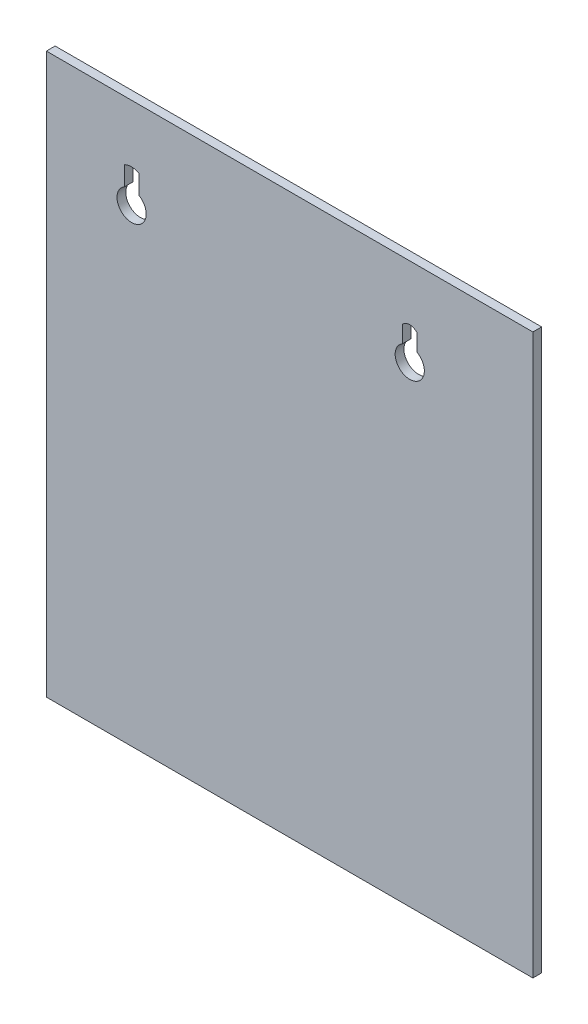
ISO-10303-21;
HEADER;
FILE_DESCRIPTION(('STEP AP214'),'2;1');
FILE_NAME('part.step','',(''),(''),'','','');
FILE_SCHEMA(('AUTOMOTIVE_DESIGN { 1 0 10303 214 1 1 1 1 }'));
ENDSEC;
DATA;
#1=APPLICATION_CONTEXT('core data for automotive mechanical design processes');
#2=APPLICATION_PROTOCOL_DEFINITION('international standard','automotive_design',2000,#1);
#3=PRODUCT_CONTEXT('',#1,'mechanical');
#4=PRODUCT('Part','Part','',(#3));
#5=PRODUCT_RELATED_PRODUCT_CATEGORY('part','',(#4));
#6=PRODUCT_DEFINITION_FORMATION('','',#4);
#7=PRODUCT_DEFINITION_CONTEXT('part definition',#1,'design');
#8=PRODUCT_DEFINITION('design','',#6,#7);
#9=PRODUCT_DEFINITION_SHAPE('','',#8);
#10=(LENGTH_UNIT() NAMED_UNIT(*) SI_UNIT(.MILLI.,.METRE.));
#11=(NAMED_UNIT(*) PLANE_ANGLE_UNIT() SI_UNIT($,.RADIAN.));
#12=(NAMED_UNIT(*) SI_UNIT($,.STERADIAN.) SOLID_ANGLE_UNIT());
#13=UNCERTAINTY_MEASURE_WITH_UNIT(LENGTH_MEASURE(1.E-05),#10,'distance_accuracy_value','');
#14=(GEOMETRIC_REPRESENTATION_CONTEXT(3) GLOBAL_UNCERTAINTY_ASSIGNED_CONTEXT((#13)) GLOBAL_UNIT_ASSIGNED_CONTEXT((#10,
#11,#12)) REPRESENTATION_CONTEXT('',''));
#15=CARTESIAN_POINT('',(0.,0.,0.));
#16=DIRECTION('',(0.,0.,1.));
#17=DIRECTION('',(1.,0.,0.));
#18=AXIS2_PLACEMENT_3D('',#15,#16,#17);
#19=CARTESIAN_POINT('',(0.,0.,1.8));
#20=DIRECTION('',(0.,0.,1.));
#21=DIRECTION('',(1.,0.,0.));
#22=AXIS2_PLACEMENT_3D('',#19,#20,#21);
#23=PLANE('',#22);
#24=CARTESIAN_POINT('',(25.7422564580005,6.75733795317251,1.8));
#25=DIRECTION('',(0.,0.,1.));
#26=DIRECTION('',(1.,0.,0.));
#27=AXIS2_PLACEMENT_3D('',#24,#25,#26);
#28=CIRCLE('',#27,3.);
#29=CARTESIAN_POINT('',(24.2422564580005,9.35541416452583,1.8));
#30=VERTEX_POINT('',#29);
#31=CARTESIAN_POINT('',(27.2422564580005,9.35541416452583,1.8));
#32=VERTEX_POINT('',#31);
#33=EDGE_CURVE('E47',#30,#32,#28,.T.);
#34=ORIENTED_EDGE('',*,*,#33,.F.);
#35=DIRECTION('',(0.,-1.,0.));
#36=VECTOR('',#35,1.);
#37=CARTESIAN_POINT('',(24.2422564580005,9.35541416452583,1.8));
#38=LINE('',#37,#36);
#39=CARTESIAN_POINT('',(24.2422564580005,12.8568097519284,1.8));
#40=VERTEX_POINT('',#39);
#41=EDGE_CURVE('E139',#40,#30,#38,.T.);
#42=ORIENTED_EDGE('',*,*,#41,.F.);
#43=CARTESIAN_POINT('',(27.2422564580005,12.8568097519284,1.8));
#44=CARTESIAN_POINT('',(25.7422564580005,14.1327453579018,1.8));
#45=CARTESIAN_POINT('',(24.2422564580005,12.8568097519284,1.8));
#46=B_SPLINE_CURVE_WITH_KNOTS('',2,(#43,#44,#45),.UNSPECIFIED.,.F.,.F.,(3,3),(0.,1.),.UNSPECIFIED.);
#47=CARTESIAN_POINT('',(27.2422564580005,12.8568097519284,1.8));
#48=VERTEX_POINT('',#47);
#49=EDGE_CURVE('E124',#48,#40,#46,.T.);
#50=ORIENTED_EDGE('',*,*,#49,.F.);
#51=DIRECTION('',(0.,1.,0.));
#52=VECTOR('',#51,1.);
#53=CARTESIAN_POINT('',(27.2422564580005,9.35541416452583,1.8));
#54=LINE('',#53,#52);
#55=EDGE_CURVE('E133',#32,#48,#54,.T.);
#56=ORIENTED_EDGE('',*,*,#55,.F.);
#57=EDGE_LOOP('',(#34,#42,#50,#56));
#58=FACE_BOUND('',#57,.T.);
#59=DIRECTION('',(0.,-1.,0.));
#60=VECTOR('',#59,1.);
#61=CARTESIAN_POINT('',(-48.9504376898145,24.8583569405099,1.8));
#62=LINE('',#61,#60);
#63=CARTESIAN_POINT('',(-48.9504376898145,24.8583569405099,1.8));
#64=VERTEX_POINT('',#63);
#65=CARTESIAN_POINT('',(-48.9504376898145,-90.1416430594901,1.8));
#66=VERTEX_POINT('',#65);
#67=EDGE_CURVE('E222',#64,#66,#62,.T.);
#68=ORIENTED_EDGE('',*,*,#67,.T.);
#69=DIRECTION('',(1.,0.,0.));
#70=VECTOR('',#69,1.);
#71=CARTESIAN_POINT('',(-48.9504376898145,-90.1416430594901,1.8));
#72=LINE('',#71,#70);
#73=CARTESIAN_POINT('',(51.0495623101855,-90.1416430594901,1.8));
#74=VERTEX_POINT('',#73);
#75=EDGE_CURVE('E385',#66,#74,#72,.T.);
#76=ORIENTED_EDGE('',*,*,#75,.T.);
#77=DIRECTION('',(0.,1.,0.));
#78=VECTOR('',#77,1.);
#79=CARTESIAN_POINT('',(51.0495623101855,24.8583569405099,1.8));
#80=LINE('',#79,#78);
#81=CARTESIAN_POINT('',(51.0495623101855,24.8583569405099,1.8));
#82=VERTEX_POINT('',#81);
#83=EDGE_CURVE('E215',#74,#82,#80,.T.);
#84=ORIENTED_EDGE('',*,*,#83,.T.);
#85=DIRECTION('',(-1.,0.,0.));
#86=VECTOR('',#85,1.);
#87=CARTESIAN_POINT('',(-48.9504376898145,24.8583569405099,1.8));
#88=LINE('',#87,#86);
#89=EDGE_CURVE('E229',#82,#64,#88,.T.);
#90=ORIENTED_EDGE('',*,*,#89,.T.);
#91=EDGE_LOOP('',(#68,#76,#84,#90));
#92=FACE_BOUND('',#91,.T.);
#93=DIRECTION('',(0.,-1.,0.));
#94=VECTOR('',#93,1.);
#95=CARTESIAN_POINT('',(-29.9284010584188,0.,1.8));
#96=LINE('',#95,#94);
#97=CARTESIAN_POINT('',(-29.9284010584188,12.65398339039,1.8));
#98=VERTEX_POINT('',#97);
#99=CARTESIAN_POINT('',(-29.9284010584188,8.69056144821355,1.8));
#100=VERTEX_POINT('',#99);
#101=EDGE_CURVE('E375',#98,#100,#96,.T.);
#102=ORIENTED_EDGE('',*,*,#101,.T.);
#103=CARTESIAN_POINT('',(-31.4284010584188,6.09248523686024,1.8));
#104=DIRECTION('',(0.,0.,1.));
#105=DIRECTION('',(1.,0.,0.));
#106=AXIS2_PLACEMENT_3D('',#103,#104,#105);
#107=CIRCLE('',#106,3.);
#108=CARTESIAN_POINT('',(-32.9284010584188,8.69056144821355,1.8));
#109=VERTEX_POINT('',#108);
#110=EDGE_CURVE('E381',#100,#109,#107,.F.);
#111=ORIENTED_EDGE('',*,*,#110,.T.);
#112=DIRECTION('',(0.,1.,0.));
#113=VECTOR('',#112,1.);
#114=CARTESIAN_POINT('',(-32.9284010584188,0.,1.8));
#115=LINE('',#114,#113);
#116=CARTESIAN_POINT('',(-32.9284010584188,12.65398339039,1.8));
#117=VERTEX_POINT('',#116);
#118=EDGE_CURVE('E350',#109,#117,#115,.T.);
#119=ORIENTED_EDGE('',*,*,#118,.T.);
#120=CARTESIAN_POINT('',(-29.9284010584188,12.65398339039,1.8));
#121=CARTESIAN_POINT('',(-31.4284010584188,13.3455747811932,1.8));
#122=CARTESIAN_POINT('',(-32.9284010584188,12.65398339039,1.8));
#123=B_SPLINE_CURVE_WITH_KNOTS('',2,(#120,#121,#122),.UNSPECIFIED.,.F.,.F.,(3,3),(0.,1.),.UNSPECIFIED.);
#124=EDGE_CURVE('E370',#117,#98,#123,.F.);
#125=ORIENTED_EDGE('',*,*,#124,.T.);
#126=EDGE_LOOP('',(#102,#111,#119,#125));
#127=FACE_BOUND('',#126,.T.);
#128=ADVANCED_FACE('F32',(#58,#92,#127),#23,.T.);
#129=CARTESIAN_POINT('',(0.,0.,0.));
#130=DIRECTION('',(0.,0.,1.));
#131=DIRECTION('',(1.,0.,0.));
#132=AXIS2_PLACEMENT_3D('',#129,#130,#131);
#133=PLANE('',#132);
#134=DIRECTION('',(0.,-1.,0.));
#135=VECTOR('',#134,1.);
#136=CARTESIAN_POINT('',(24.2422564580005,0.,0.));
#137=LINE('',#136,#135);
#138=CARTESIAN_POINT('',(24.2422564580005,12.8568097519284,0.));
#139=VERTEX_POINT('',#138);
#140=CARTESIAN_POINT('',(24.2422564580005,9.35541416452583,0.));
#141=VERTEX_POINT('',#140);
#142=EDGE_CURVE('E40',#139,#141,#137,.T.);
#143=ORIENTED_EDGE('',*,*,#142,.T.);
#144=CARTESIAN_POINT('',(25.7422564580005,6.75733795317251,0.));
#145=DIRECTION('',(0.,0.,1.));
#146=DIRECTION('',(1.,0.,0.));
#147=AXIS2_PLACEMENT_3D('',#144,#145,#146);
#148=CIRCLE('',#147,3.);
#149=CARTESIAN_POINT('',(27.2422564580005,9.35541416452583,0.));
#150=VERTEX_POINT('',#149);
#151=EDGE_CURVE('E11',#141,#150,#148,.T.);
#152=ORIENTED_EDGE('',*,*,#151,.T.);
#153=DIRECTION('',(0.,1.,0.));
#154=VECTOR('',#153,1.);
#155=CARTESIAN_POINT('',(27.2422564580005,0.,0.));
#156=LINE('',#155,#154);
#157=CARTESIAN_POINT('',(27.2422564580005,12.8568097519284,0.));
#158=VERTEX_POINT('',#157);
#159=EDGE_CURVE('E232',#150,#158,#156,.T.);
#160=ORIENTED_EDGE('',*,*,#159,.T.);
#161=CARTESIAN_POINT('',(27.2422564580005,12.8568097519284,0.));
#162=CARTESIAN_POINT('',(25.7422564580005,14.1327453579018,0.));
#163=CARTESIAN_POINT('',(24.2422564580005,12.8568097519284,0.));
#164=B_SPLINE_CURVE_WITH_KNOTS('',2,(#161,#162,#163),.UNSPECIFIED.,.F.,.F.,(3,3),(0.,1.),.UNSPECIFIED.);
#165=EDGE_CURVE('E127',#158,#139,#164,.T.);
#166=ORIENTED_EDGE('',*,*,#165,.T.);
#167=EDGE_LOOP('',(#143,#152,#160,#166));
#168=FACE_BOUND('',#167,.T.);
#169=DIRECTION('',(0.,-1.,0.));
#170=VECTOR('',#169,1.);
#171=CARTESIAN_POINT('',(-48.9504376898145,24.8583569405099,0.));
#172=LINE('',#171,#170);
#173=CARTESIAN_POINT('',(-48.9504376898145,24.8583569405099,0.));
#174=VERTEX_POINT('',#173);
#175=CARTESIAN_POINT('',(-48.9504376898145,-90.1416430594901,0.));
#176=VERTEX_POINT('',#175);
#177=EDGE_CURVE('E211',#174,#176,#172,.T.);
#178=ORIENTED_EDGE('',*,*,#177,.F.);
#179=DIRECTION('',(-1.,0.,0.));
#180=VECTOR('',#179,1.);
#181=CARTESIAN_POINT('',(-48.9504376898145,24.8583569405099,0.));
#182=LINE('',#181,#180);
#183=CARTESIAN_POINT('',(51.0495623101855,24.8583569405099,0.));
#184=VERTEX_POINT('',#183);
#185=EDGE_CURVE('E220',#184,#174,#182,.T.);
#186=ORIENTED_EDGE('',*,*,#185,.F.);
#187=DIRECTION('',(0.,1.,0.));
#188=VECTOR('',#187,1.);
#189=CARTESIAN_POINT('',(51.0495623101855,24.8583569405099,0.));
#190=LINE('',#189,#188);
#191=CARTESIAN_POINT('',(51.0495623101855,-90.1416430594901,0.));
#192=VERTEX_POINT('',#191);
#193=EDGE_CURVE('E210',#192,#184,#190,.T.);
#194=ORIENTED_EDGE('',*,*,#193,.F.);
#195=DIRECTION('',(1.,0.,0.));
#196=VECTOR('',#195,1.);
#197=CARTESIAN_POINT('',(-48.9504376898145,-90.1416430594901,0.));
#198=LINE('',#197,#196);
#199=EDGE_CURVE('E200',#176,#192,#198,.T.);
#200=ORIENTED_EDGE('',*,*,#199,.F.);
#201=EDGE_LOOP('',(#178,#186,#194,#200));
#202=FACE_BOUND('',#201,.T.);
#203=CARTESIAN_POINT('',(-31.4284010584188,6.09248523686024,0.));
#204=DIRECTION('',(0.,0.,1.));
#205=DIRECTION('',(1.,0.,0.));
#206=AXIS2_PLACEMENT_3D('',#203,#204,#205);
#207=CIRCLE('',#206,3.);
#208=CARTESIAN_POINT('',(-32.9284010584188,8.69056144821355,0.));
#209=VERTEX_POINT('',#208);
#210=CARTESIAN_POINT('',(-29.9284010584188,8.69056144821355,0.));
#211=VERTEX_POINT('',#210);
#212=EDGE_CURVE('E151',#209,#211,#207,.T.);
#213=ORIENTED_EDGE('',*,*,#212,.T.);
#214=DIRECTION('',(0.,1.,0.));
#215=VECTOR('',#214,1.);
#216=CARTESIAN_POINT('',(-29.9284010584188,8.69056144821355,0.));
#217=LINE('',#216,#215);
#218=CARTESIAN_POINT('',(-29.9284010584188,12.65398339039,0.));
#219=VERTEX_POINT('',#218);
#220=EDGE_CURVE('E359',#211,#219,#217,.T.);
#221=ORIENTED_EDGE('',*,*,#220,.T.);
#222=CARTESIAN_POINT('',(-29.9284010584188,12.65398339039,0.));
#223=CARTESIAN_POINT('',(-31.4284010584188,13.3455747811932,0.));
#224=CARTESIAN_POINT('',(-32.9284010584188,12.65398339039,0.));
#225=B_SPLINE_CURVE_WITH_KNOTS('',2,(#222,#223,#224),.UNSPECIFIED.,.F.,.F.,(3,3),(0.,1.),.UNSPECIFIED.);
#226=CARTESIAN_POINT('',(-32.9284010584188,12.65398339039,0.));
#227=VERTEX_POINT('',#226);
#228=EDGE_CURVE('E357',#219,#227,#225,.T.);
#229=ORIENTED_EDGE('',*,*,#228,.T.);
#230=DIRECTION('',(0.,-1.,0.));
#231=VECTOR('',#230,1.);
#232=CARTESIAN_POINT('',(-32.9284010584188,8.69056144821355,0.));
#233=LINE('',#232,#231);
#234=EDGE_CURVE('E347',#227,#209,#233,.T.);
#235=ORIENTED_EDGE('',*,*,#234,.T.);
#236=EDGE_LOOP('',(#213,#221,#229,#235));
#237=FACE_BOUND('',#236,.T.);
#238=ADVANCED_FACE('F181',(#168,#202,#237),#133,.F.);
#239=CARTESIAN_POINT('',(-48.9504376898145,24.8583569405099,1.8));
#240=DIRECTION('',(1.,0.,0.));
#241=DIRECTION('',(0.,1.,0.));
#242=AXIS2_PLACEMENT_3D('',#239,#240,#241);
#243=PLANE('',#242);
#244=ORIENTED_EDGE('',*,*,#177,.T.);
#245=DIRECTION('',(0.,0.,-1.));
#246=VECTOR('',#245,1.);
#247=CARTESIAN_POINT('',(-48.9504376898145,-90.1416430594901,1.8));
#248=LINE('',#247,#246);
#249=EDGE_CURVE('E205',#66,#176,#248,.T.);
#250=ORIENTED_EDGE('',*,*,#249,.F.);
#251=ORIENTED_EDGE('',*,*,#67,.F.);
#252=DIRECTION('',(0.,0.,-1.));
#253=VECTOR('',#252,1.);
#254=CARTESIAN_POINT('',(-48.9504376898145,24.8583569405099,1.8));
#255=LINE('',#254,#253);
#256=EDGE_CURVE('E226',#64,#174,#255,.T.);
#257=ORIENTED_EDGE('',*,*,#256,.T.);
#258=EDGE_LOOP('',(#244,#250,#251,#257));
#259=FACE_BOUND('',#258,.T.);
#260=ADVANCED_FACE('F34',(#259),#243,.F.);
#261=CARTESIAN_POINT('',(-48.9504376898145,-90.1416430594901,1.8));
#262=DIRECTION('',(0.,1.,0.));
#263=DIRECTION('',(0.,0.,1.));
#264=AXIS2_PLACEMENT_3D('',#261,#262,#263);
#265=PLANE('',#264);
#266=ORIENTED_EDGE('',*,*,#199,.T.);
#267=DIRECTION('',(0.,0.,-1.));
#268=VECTOR('',#267,1.);
#269=CARTESIAN_POINT('',(51.0495623101855,-90.1416430594901,1.8));
#270=LINE('',#269,#268);
#271=EDGE_CURVE('E202',#74,#192,#270,.T.);
#272=ORIENTED_EDGE('',*,*,#271,.F.);
#273=ORIENTED_EDGE('',*,*,#75,.F.);
#274=ORIENTED_EDGE('',*,*,#249,.T.);
#275=EDGE_LOOP('',(#266,#272,#273,#274));
#276=FACE_BOUND('',#275,.T.);
#277=ADVANCED_FACE('F190',(#276),#265,.F.);
#278=CARTESIAN_POINT('',(51.0495623101855,24.8583569405099,1.8));
#279=DIRECTION('',(-1.,0.,0.));
#280=DIRECTION('',(0.,-1.,0.));
#281=AXIS2_PLACEMENT_3D('',#278,#279,#280);
#282=PLANE('',#281);
#283=ORIENTED_EDGE('',*,*,#193,.T.);
#284=DIRECTION('',(0.,0.,-1.));
#285=VECTOR('',#284,1.);
#286=CARTESIAN_POINT('',(51.0495623101855,24.8583569405099,1.8));
#287=LINE('',#286,#285);
#288=EDGE_CURVE('E216',#82,#184,#287,.T.);
#289=ORIENTED_EDGE('',*,*,#288,.F.);
#290=ORIENTED_EDGE('',*,*,#83,.F.);
#291=ORIENTED_EDGE('',*,*,#271,.T.);
#292=EDGE_LOOP('',(#283,#289,#290,#291));
#293=FACE_BOUND('',#292,.T.);
#294=ADVANCED_FACE('F187',(#293),#282,.F.);
#295=CARTESIAN_POINT('',(-48.9504376898145,24.8583569405099,1.8));
#296=DIRECTION('',(0.,-1.,0.));
#297=DIRECTION('',(0.,0.,-1.));
#298=AXIS2_PLACEMENT_3D('',#295,#296,#297);
#299=PLANE('',#298);
#300=ORIENTED_EDGE('',*,*,#185,.T.);
#301=ORIENTED_EDGE('',*,*,#256,.F.);
#302=ORIENTED_EDGE('',*,*,#89,.F.);
#303=ORIENTED_EDGE('',*,*,#288,.T.);
#304=EDGE_LOOP('',(#300,#301,#302,#303));
#305=FACE_BOUND('',#304,.T.);
#306=ADVANCED_FACE('F177',(#305),#299,.F.);
#307=CARTESIAN_POINT('',(-31.4284010584188,6.09248523686024,10.));
#308=DIRECTION('',(0.,0.,-1.));
#309=DIRECTION('',(-1.,0.,0.));
#310=AXIS2_PLACEMENT_3D('',#307,#308,#309);
#311=CYLINDRICAL_SURFACE('',#310,3.);
#312=DIRECTION('',(0.,0.,-1.));
#313=VECTOR('',#312,1.);
#314=CARTESIAN_POINT('',(-29.9284010584188,8.69056144821355,10.));
#315=LINE('',#314,#313);
#316=EDGE_CURVE('E367',#100,#211,#315,.T.);
#317=ORIENTED_EDGE('',*,*,#316,.T.);
#318=ORIENTED_EDGE('',*,*,#212,.F.);
#319=DIRECTION('',(0.,0.,-1.));
#320=VECTOR('',#319,1.);
#321=CARTESIAN_POINT('',(-32.9284010584188,8.69056144821355,10.));
#322=LINE('',#321,#320);
#323=EDGE_CURVE('E345',#109,#209,#322,.T.);
#324=ORIENTED_EDGE('',*,*,#323,.F.);
#325=ORIENTED_EDGE('',*,*,#110,.F.);
#326=EDGE_LOOP('',(#317,#318,#324,#325));
#327=FACE_BOUND('',#326,.T.);
#328=ADVANCED_FACE('F173',(#327),#311,.F.);
#329=CARTESIAN_POINT('',(-29.9284010584188,8.69056144821355,10.));
#330=DIRECTION('',(-1.,0.,0.));
#331=DIRECTION('',(0.,0.,1.));
#332=AXIS2_PLACEMENT_3D('',#329,#330,#331);
#333=PLANE('',#332);
#334=DIRECTION('',(0.,0.,-1.));
#335=VECTOR('',#334,1.);
#336=CARTESIAN_POINT('',(-29.9284010584188,12.65398339039,10.));
#337=LINE('',#336,#335);
#338=EDGE_CURVE('E365',#98,#219,#337,.T.);
#339=ORIENTED_EDGE('',*,*,#338,.T.);
#340=ORIENTED_EDGE('',*,*,#220,.F.);
#341=ORIENTED_EDGE('',*,*,#316,.F.);
#342=ORIENTED_EDGE('',*,*,#101,.F.);
#343=EDGE_LOOP('',(#339,#340,#341,#342));
#344=FACE_BOUND('',#343,.T.);
#345=ADVANCED_FACE('F168',(#344),#333,.T.);
#346=CARTESIAN_POINT('',(-29.9284010584188,12.65398339039,10.));
#347=CARTESIAN_POINT('',(-31.4284010584188,13.3455747811932,10.));
#348=CARTESIAN_POINT('',(-32.9284010584188,12.65398339039,10.));
#349=B_SPLINE_CURVE_WITH_KNOTS('',2,(#346,#347,#348),.UNSPECIFIED.,.F.,.F.,(3,3),(0.,1.),.UNSPECIFIED.);
#350=DIRECTION('',(0.,0.,-1.));
#351=VECTOR('',#350,1.);
#352=SURFACE_OF_LINEAR_EXTRUSION('',#349,#351);
#353=DIRECTION('',(0.,0.,-1.));
#354=VECTOR('',#353,1.);
#355=CARTESIAN_POINT('',(-32.9284010584188,12.65398339039,10.));
#356=LINE('',#355,#354);
#357=EDGE_CURVE('E352',#117,#227,#356,.T.);
#358=ORIENTED_EDGE('',*,*,#357,.T.);
#359=ORIENTED_EDGE('',*,*,#228,.F.);
#360=ORIENTED_EDGE('',*,*,#338,.F.);
#361=ORIENTED_EDGE('',*,*,#124,.F.);
#362=EDGE_LOOP('',(#358,#359,#360,#361));
#363=FACE_BOUND('',#362,.T.);
#364=ADVANCED_FACE('F163',(#363),#352,.T.);
#365=CARTESIAN_POINT('',(-32.9284010584188,8.69056144821355,10.));
#366=DIRECTION('',(1.,0.,0.));
#367=DIRECTION('',(0.,0.,-1.));
#368=AXIS2_PLACEMENT_3D('',#365,#366,#367);
#369=PLANE('',#368);
#370=ORIENTED_EDGE('',*,*,#323,.T.);
#371=ORIENTED_EDGE('',*,*,#234,.F.);
#372=ORIENTED_EDGE('',*,*,#357,.F.);
#373=ORIENTED_EDGE('',*,*,#118,.F.);
#374=EDGE_LOOP('',(#370,#371,#372,#373));
#375=FACE_BOUND('',#374,.T.);
#376=ADVANCED_FACE('F167',(#375),#369,.T.);
#377=CARTESIAN_POINT('',(25.7422564580005,6.75733795317251,-8.2));
#378=DIRECTION('',(0.,0.,1.));
#379=DIRECTION('',(1.,0.,0.));
#380=AXIS2_PLACEMENT_3D('',#377,#378,#379);
#381=CYLINDRICAL_SURFACE('',#380,3.);
#382=DIRECTION('',(0.,0.,1.));
#383=VECTOR('',#382,1.);
#384=CARTESIAN_POINT('',(24.2422564580005,9.35541416452583,-8.2));
#385=LINE('',#384,#383);
#386=EDGE_CURVE('E149',#141,#30,#385,.T.);
#387=ORIENTED_EDGE('',*,*,#386,.T.);
#388=ORIENTED_EDGE('',*,*,#33,.T.);
#389=DIRECTION('',(0.,0.,1.));
#390=VECTOR('',#389,1.);
#391=CARTESIAN_POINT('',(27.2422564580005,9.35541416452583,-8.2));
#392=LINE('',#391,#390);
#393=EDGE_CURVE('E130',#150,#32,#392,.T.);
#394=ORIENTED_EDGE('',*,*,#393,.F.);
#395=ORIENTED_EDGE('',*,*,#151,.F.);
#396=EDGE_LOOP('',(#387,#388,#394,#395));
#397=FACE_BOUND('',#396,.T.);
#398=ADVANCED_FACE('F243',(#397),#381,.F.);
#399=CARTESIAN_POINT('',(24.2422564580005,9.35541416452583,-8.2));
#400=DIRECTION('',(-1.,0.,0.));
#401=DIRECTION('',(0.,0.,1.));
#402=AXIS2_PLACEMENT_3D('',#399,#400,#401);
#403=PLANE('',#402);
#404=DIRECTION('',(0.,0.,1.));
#405=VECTOR('',#404,1.);
#406=CARTESIAN_POINT('',(24.2422564580005,12.8568097519284,-8.2));
#407=LINE('',#406,#405);
#408=EDGE_CURVE('E129',#139,#40,#407,.T.);
#409=ORIENTED_EDGE('',*,*,#408,.T.);
#410=ORIENTED_EDGE('',*,*,#41,.T.);
#411=ORIENTED_EDGE('',*,*,#386,.F.);
#412=ORIENTED_EDGE('',*,*,#142,.F.);
#413=EDGE_LOOP('',(#409,#410,#411,#412));
#414=FACE_BOUND('',#413,.T.);
#415=ADVANCED_FACE('F242',(#414),#403,.F.);
#416=CARTESIAN_POINT('',(27.2422564580005,12.8568097519284,-8.2));
#417=CARTESIAN_POINT('',(25.7422564580005,14.1327453579018,-8.2));
#418=CARTESIAN_POINT('',(24.2422564580005,12.8568097519284,-8.2));
#419=B_SPLINE_CURVE_WITH_KNOTS('',2,(#416,#417,#418),.UNSPECIFIED.,.F.,.F.,(3,3),(0.,1.),.UNSPECIFIED.);
#420=DIRECTION('',(0.,0.,1.));
#421=VECTOR('',#420,1.);
#422=SURFACE_OF_LINEAR_EXTRUSION('',#419,#421);
#423=DIRECTION('',(0.,0.,1.));
#424=VECTOR('',#423,1.);
#425=CARTESIAN_POINT('',(27.2422564580005,12.8568097519284,-8.2));
#426=LINE('',#425,#424);
#427=EDGE_CURVE('E55',#158,#48,#426,.T.);
#428=ORIENTED_EDGE('',*,*,#427,.T.);
#429=ORIENTED_EDGE('',*,*,#49,.T.);
#430=ORIENTED_EDGE('',*,*,#408,.F.);
#431=ORIENTED_EDGE('',*,*,#165,.F.);
#432=EDGE_LOOP('',(#428,#429,#430,#431));
#433=FACE_BOUND('',#432,.T.);
#434=ADVANCED_FACE('F121',(#433),#422,.F.);
#435=CARTESIAN_POINT('',(27.2422564580005,9.35541416452583,-8.2));
#436=DIRECTION('',(1.,0.,0.));
#437=DIRECTION('',(0.,0.,-1.));
#438=AXIS2_PLACEMENT_3D('',#435,#436,#437);
#439=PLANE('',#438);
#440=ORIENTED_EDGE('',*,*,#393,.T.);
#441=ORIENTED_EDGE('',*,*,#55,.T.);
#442=ORIENTED_EDGE('',*,*,#427,.F.);
#443=ORIENTED_EDGE('',*,*,#159,.F.);
#444=EDGE_LOOP('',(#440,#441,#442,#443));
#445=FACE_BOUND('',#444,.T.);
#446=ADVANCED_FACE('F134',(#445),#439,.F.);
#447=CLOSED_SHELL('',(#128,#238,#260,#277,#294,#306,#328,#345,#364,#376,#398,#415,#434,#446));
#448=MANIFOLD_SOLID_BREP('B2',#447);
#449=ADVANCED_BREP_SHAPE_REPRESENTATION('',(#18,#448),#14);
#450=SHAPE_DEFINITION_REPRESENTATION(#9,#449);
ENDSEC;
END-ISO-10303-21;
